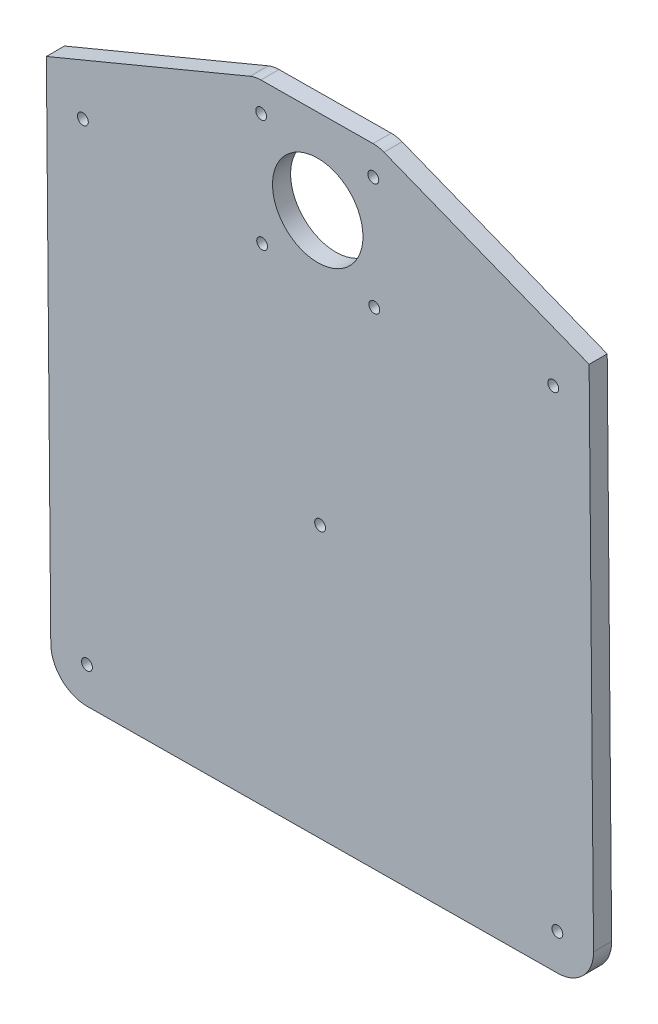
ISO-10303-21;
HEADER;
FILE_DESCRIPTION(('STEP AP214'),'2;1');
FILE_NAME('part.step','',(''),(''),'','','');
FILE_SCHEMA(('AUTOMOTIVE_DESIGN { 1 0 10303 214 1 1 1 1 }'));
ENDSEC;
DATA;
#1=APPLICATION_CONTEXT('core data for automotive mechanical design processes');
#2=APPLICATION_PROTOCOL_DEFINITION('international standard','automotive_design',2000,#1);
#3=PRODUCT_CONTEXT('',#1,'mechanical');
#4=PRODUCT('Part','Part','',(#3));
#5=PRODUCT_RELATED_PRODUCT_CATEGORY('part','',(#4));
#6=PRODUCT_DEFINITION_FORMATION('','',#4);
#7=PRODUCT_DEFINITION_CONTEXT('part definition',#1,'design');
#8=PRODUCT_DEFINITION('design','',#6,#7);
#9=PRODUCT_DEFINITION_SHAPE('','',#8);
#10=(LENGTH_UNIT() NAMED_UNIT(*) SI_UNIT(.MILLI.,.METRE.));
#11=(NAMED_UNIT(*) PLANE_ANGLE_UNIT() SI_UNIT($,.RADIAN.));
#12=(NAMED_UNIT(*) SI_UNIT($,.STERADIAN.) SOLID_ANGLE_UNIT());
#13=UNCERTAINTY_MEASURE_WITH_UNIT(LENGTH_MEASURE(1.E-05),#10,'distance_accuracy_value','');
#14=(GEOMETRIC_REPRESENTATION_CONTEXT(3) GLOBAL_UNCERTAINTY_ASSIGNED_CONTEXT((#13)) GLOBAL_UNIT_ASSIGNED_CONTEXT((#10,
#11,#12)) REPRESENTATION_CONTEXT('',''));
#15=CARTESIAN_POINT('',(0.,0.,0.));
#16=DIRECTION('',(0.,0.,1.));
#17=DIRECTION('',(1.,0.,0.));
#18=AXIS2_PLACEMENT_3D('',#15,#16,#17);
#19=CARTESIAN_POINT('',(65.5647498088941,-64.4303001875905,-2.4999999999521));
#20=DIRECTION('',(7.37104509450021E-13,0.,-1.));
#21=DIRECTION('',(0.999961923064146,0.0087265355012742,7.37132577199878E-13));
#22=AXIS2_PLACEMENT_3D('',#19,#20,#21);
#23=PLANE('',#22);
#24=CARTESIAN_POINT('',(64.4303001937285,65.5647498107485,-2.4999999999521));
#25=DIRECTION('',(7.37104509450021E-13,0.,-1.));
#26=DIRECTION('',(0.999961923064146,0.0087265355012742,7.37132577199878E-13));
#27=AXIS2_PLACEMENT_3D('',#24,#25,#26);
#28=CIRCLE('',#27,1.5);
#29=CARTESIAN_POINT('',(65.9302430783247,65.5778396140005,-2.49999999995099));
#30=VERTEX_POINT('',#29);
#31=EDGE_CURVE('E259',#30,#30,#28,.T.);
#32=ORIENTED_EDGE('',*,*,#31,.F.);
#33=EDGE_LOOP('',(#32));
#34=FACE_BOUND('',#33,.T.);
#35=CARTESIAN_POINT('',(-64.4303001894448,-65.5647498027561,-2.50000000004793));
#36=DIRECTION('',(7.37104509450021E-13,0.,-1.));
#37=DIRECTION('',(0.999961923064146,0.0087265355012742,7.37132577199878E-13));
#38=AXIS2_PLACEMENT_3D('',#35,#36,#37);
#39=CIRCLE('',#38,1.5);
#40=CARTESIAN_POINT('',(-62.9303573048486,-65.5516599995042,-2.50000000004682));
#41=VERTEX_POINT('',#40);
#42=EDGE_CURVE('E247',#41,#41,#39,.T.);
#43=ORIENTED_EDGE('',*,*,#42,.F.);
#44=EDGE_LOOP('',(#43));
#45=FACE_BOUND('',#44,.T.);
#46=CARTESIAN_POINT('',(-65.5647498046105,64.4303001955829,-2.50000000004793));
#47=DIRECTION('',(7.37104509450021E-13,0.,-1.));
#48=DIRECTION('',(0.999961923064146,0.0087265355012742,7.37132577199878E-13));
#49=AXIS2_PLACEMENT_3D('',#46,#47,#48);
#50=CIRCLE('',#49,1.5);
#51=CARTESIAN_POINT('',(-64.0648069200142,64.4433899988348,-2.50000000004682));
#52=VERTEX_POINT('',#51);
#53=EDGE_CURVE('E235',#52,#52,#50,.T.);
#54=ORIENTED_EDGE('',*,*,#53,.F.);
#55=EDGE_LOOP('',(#54));
#56=FACE_BOUND('',#55,.T.);
#57=CARTESIAN_POINT('',(14.9801809473103,59.6329957265826,-2.49999999998859));
#58=DIRECTION('',(7.37104509450021E-13,0.,-1.));
#59=DIRECTION('',(0.999961923064146,0.0087265355012742,7.37132577199878E-13));
#60=AXIS2_PLACEMENT_3D('',#57,#58,#59);
#61=CIRCLE('',#60,1.5);
#62=CARTESIAN_POINT('',(16.4801238319065,59.6460855298345,-2.49999999998748));
#63=VERTEX_POINT('',#62);
#64=EDGE_CURVE('E223',#63,#63,#61,.T.);
#65=ORIENTED_EDGE('',*,*,#64,.F.);
#66=EDGE_LOOP('',(#65));
#67=FACE_BOUND('',#66,.T.);
#68=CARTESIAN_POINT('',(-16.2891612682177,90.3612927410316,-2.50000000001144));
#69=DIRECTION('',(7.37104509450021E-13,0.,-1.));
#70=DIRECTION('',(0.999961923064146,0.0087265355012742,7.37132577199878E-13));
#71=AXIS2_PLACEMENT_3D('',#68,#69,#70);
#72=CIRCLE('',#71,1.5);
#73=CARTESIAN_POINT('',(-14.7892183836215,90.3743825442835,-2.50000000001033));
#74=VERTEX_POINT('',#73);
#75=EDGE_CURVE('E151',#74,#74,#72,.T.);
#76=ORIENTED_EDGE('',*,*,#75,.F.);
#77=EDGE_LOOP('',(#76));
#78=FACE_BOUND('',#77,.T.);
#79=DIRECTION('',(0.92992224530798,-0.367756193260379,6.83084246962648E-13));
#80=VECTOR('',#79,1.);
#81=CARTESIAN_POINT('',(17.6517078928538,98.071193304035,-2.49999999998637));
#82=LINE('',#81,#80);
#83=CARTESIAN_POINT('',(17.6517078928538,98.071193304035,-2.49999999998637));
#84=VERTEX_POINT('',#83);
#85=CARTESIAN_POINT('',(74.3426540693572,75.6516343964027,-2.49999999994473));
#86=VERTEX_POINT('',#85);
#87=EDGE_CURVE('E166',#84,#86,#82,.T.);
#88=ORIENTED_EDGE('',*,*,#87,.T.);
#89=DIRECTION('',(0.0087265355012742,-0.999961923064146,0.));
#90=VECTOR('',#89,1.);
#91=CARTESIAN_POINT('',(74.3426540693572,75.6516343964027,-2.49999999994473));
#92=LINE('',#91,#90);
#93=CARTESIAN_POINT('',(75.5643690395356,-64.3430348325777,-2.49999999994473));
#94=VERTEX_POINT('',#93);
#95=EDGE_CURVE('E104',#86,#94,#92,.T.);
#96=ORIENTED_EDGE('',*,*,#95,.T.);
#97=CARTESIAN_POINT('',(65.5647498088941,-64.4303001875905,-2.4999999999521));
#98=DIRECTION('',(7.37104509450021E-13,0.,-1.));
#99=DIRECTION('',(0.999961923064146,0.0087265355012742,7.37132577199878E-13));
#100=AXIS2_PLACEMENT_3D('',#97,#98,#99);
#101=CIRCLE('',#100,10.);
#102=CARTESIAN_POINT('',(65.6520151639068,-74.4299194182319,-2.4999999999521));
#103=VERTEX_POINT('',#102);
#104=EDGE_CURVE('E187',#94,#103,#101,.T.);
#105=ORIENTED_EDGE('',*,*,#104,.T.);
#106=DIRECTION('',(-0.999961923064146,-0.0087265355012742,-7.37132577199878E-13));
#107=VECTOR('',#106,1.);
#108=CARTESIAN_POINT('',(65.6520151639068,-74.4299194182319,-2.4999999999521));
#109=LINE('',#108,#107);
#110=CARTESIAN_POINT('',(-64.3430348344321,-75.5643690333976,-2.50000000004793));
#111=VERTEX_POINT('',#110);
#112=EDGE_CURVE('E206',#103,#111,#109,.T.);
#113=ORIENTED_EDGE('',*,*,#112,.T.);
#114=CARTESIAN_POINT('',(-64.4303001894448,-65.5647498027561,-2.50000000004793));
#115=DIRECTION('',(7.37104509450021E-13,0.,-1.));
#116=DIRECTION('',(-0.999961923064146,-0.0087265355012742,-7.37132577199878E-13));
#117=AXIS2_PLACEMENT_3D('',#114,#115,#116);
#118=CIRCLE('',#117,10.);
#119=CARTESIAN_POINT('',(-74.4299194200863,-65.6520151577689,-2.5000000000553));
#120=VERTEX_POINT('',#119);
#121=EDGE_CURVE('E203',#111,#120,#118,.T.);
#122=ORIENTED_EDGE('',*,*,#121,.T.);
#123=DIRECTION('',(-0.0087265355012744,0.999961923064146,0.));
#124=VECTOR('',#123,1.);
#125=CARTESIAN_POINT('',(-75.6516343902647,74.3426540712116,-2.5000000000553));
#126=LINE('',#125,#124);
#127=CARTESIAN_POINT('',(-75.6516343902647,74.3426540712116,-2.5000000000553));
#128=VERTEX_POINT('',#127);
#129=EDGE_CURVE('E205',#120,#128,#126,.T.);
#130=ORIENTED_EDGE('',*,*,#129,.T.);
#131=DIRECTION('',(0.923362383089004,0.383929563196421,6.83084246962648E-13));
#132=VECTOR('',#131,1.);
#133=CARTESIAN_POINT('',(-19.3605977737891,97.7481918057437,-2.50000000001366));
#134=LINE('',#133,#132);
#135=CARTESIAN_POINT('',(-19.3605977737891,97.7481918057437,-2.50000000001366));
#136=VERTEX_POINT('',#135);
#137=EDGE_CURVE('E129',#128,#136,#134,.T.);
#138=ORIENTED_EDGE('',*,*,#137,.T.);
#139=CARTESIAN_POINT('',(-16.2891612682177,90.3612927410316,-2.50000000001144));
#140=DIRECTION('',(7.37104509450021E-13,0.,-1.));
#141=DIRECTION('',(-0.999961923064146,-0.0087265355012742,-7.37132577199878E-13));
#142=AXIS2_PLACEMENT_3D('',#139,#140,#141);
#143=CIRCLE('',#142,7.99999999999999);
#144=CARTESIAN_POINT('',(-16.3589735522279,98.3609881255448,-2.50000000001144));
#145=VERTEX_POINT('',#144);
#146=EDGE_CURVE('E123',#136,#145,#143,.T.);
#147=ORIENTED_EDGE('',*,*,#146,.T.);
#148=DIRECTION('',(0.999961923064146,0.0087265355012742,7.37132577199878E-13));
#149=VECTOR('',#148,1.);
#150=CARTESIAN_POINT('',(14.6398460627606,98.6315107260843,-2.49999999998859));
#151=LINE('',#150,#149);
#152=CARTESIAN_POINT('',(14.6398460627606,98.6315107260843,-2.49999999998859));
#153=VERTEX_POINT('',#152);
#154=EDGE_CURVE('E127',#145,#153,#151,.T.);
#155=ORIENTED_EDGE('',*,*,#154,.T.);
#156=CARTESIAN_POINT('',(14.7096583467708,90.6318153415711,-2.49999999998859));
#157=DIRECTION('',(7.37104509450021E-13,0.,-1.));
#158=DIRECTION('',(0.999961923064146,0.0087265355012742,7.37132577199878E-13));
#159=AXIS2_PLACEMENT_3D('',#156,#157,#158);
#160=CIRCLE('',#159,8.00000000000001);
#161=EDGE_CURVE('E55',#153,#84,#160,.T.);
#162=ORIENTED_EDGE('',*,*,#161,.T.);
#163=EDGE_LOOP('',(#88,#96,#105,#113,#122,#130,#138,#147,#155,#162));
#164=FACE_BOUND('',#163,.T.);
#165=CARTESIAN_POINT('',(14.7096583467708,90.6318153415711,-2.49999999998859));
#166=DIRECTION('',(7.37104509450021E-13,0.,-1.));
#167=DIRECTION('',(0.999961923064146,0.0087265355012742,7.37132577199878E-13));
#168=AXIS2_PLACEMENT_3D('',#165,#166,#167);
#169=CIRCLE('',#168,1.50000000000001);
#170=CARTESIAN_POINT('',(16.209601231367,90.644905144823,-2.49999999998748));
#171=VERTEX_POINT('',#170);
#172=EDGE_CURVE('E217',#171,#171,#169,.T.);
#173=ORIENTED_EDGE('',*,*,#172,.F.);
#174=EDGE_LOOP('',(#173));
#175=FACE_BOUND('',#174,.T.);
#176=CARTESIAN_POINT('',(-16.0186386676782,59.3624731260431,-2.50000000001144));
#177=DIRECTION('',(7.37104509450021E-13,0.,-1.));
#178=DIRECTION('',(0.999961923064146,0.0087265355012742,7.37132577199878E-13));
#179=AXIS2_PLACEMENT_3D('',#176,#177,#178);
#180=CIRCLE('',#179,1.5);
#181=CARTESIAN_POINT('',(-14.518695783082,59.375562929295,-2.50000000001033));
#182=VERTEX_POINT('',#181);
#183=EDGE_CURVE('E229',#182,#182,#180,.T.);
#184=ORIENTED_EDGE('',*,*,#183,.F.);
#185=EDGE_LOOP('',(#184));
#186=FACE_BOUND('',#185,.T.);
#187=CARTESIAN_POINT('',(-0.654490160453739,74.9971442338071,-2.50000000000001));
#188=DIRECTION('',(7.37104509450021E-13,0.,-1.));
#189=DIRECTION('',(0.999961923064146,0.0087265355012742,7.37132577199878E-13));
#190=AXIS2_PLACEMENT_3D('',#187,#188,#189);
#191=CIRCLE('',#190,12.5);
#192=CARTESIAN_POINT('',(11.8450338778481,75.1062259275731,-2.4999999999908));
#193=VERTEX_POINT('',#192);
#194=EDGE_CURVE('E241',#193,#193,#191,.T.);
#195=ORIENTED_EDGE('',*,*,#194,.F.);
#196=EDGE_LOOP('',(#195));
#197=FACE_BOUND('',#196,.T.);
#198=CARTESIAN_POINT('',(65.5647498088941,-64.4303001875905,-2.4999999999521));
#199=DIRECTION('',(7.37104509450021E-13,0.,-1.));
#200=DIRECTION('',(0.999961923064146,0.0087265355012742,7.37132577199878E-13));
#201=AXIS2_PLACEMENT_3D('',#198,#199,#200);
#202=CIRCLE('',#201,1.5);
#203=CARTESIAN_POINT('',(67.0646926934903,-64.4172103843385,-2.49999999995099));
#204=VERTEX_POINT('',#203);
#205=EDGE_CURVE('E253',#204,#204,#202,.T.);
#206=ORIENTED_EDGE('',*,*,#205,.F.);
#207=EDGE_LOOP('',(#206));
#208=FACE_BOUND('',#207,.T.);
#209=CARTESIAN_POINT('',(2.14182664659557E-09,3.99620267432788E-09,-2.50000000000001));
#210=DIRECTION('',(7.37104509450021E-13,0.,-1.));
#211=DIRECTION('',(0.999961923064146,0.0087265355012742,7.37132577199878E-13));
#212=AXIS2_PLACEMENT_3D('',#209,#210,#211);
#213=CIRCLE('',#212,1.5);
#214=CARTESIAN_POINT('',(1.49994288673805,0.013089807248114,-2.49999999999891));
#215=VERTEX_POINT('',#214);
#216=EDGE_CURVE('E265',#215,#215,#213,.T.);
#217=ORIENTED_EDGE('',*,*,#216,.F.);
#218=EDGE_LOOP('',(#217));
#219=FACE_BOUND('',#218,.T.);
#220=ADVANCED_FACE('F38',(#34,#45,#56,#67,#78,#164,#175,#186,#197,#208,#219),#23,.T.);
#221=CARTESIAN_POINT('',(65.5647498088904,-64.4303001875905,2.5000000000479));
#222=DIRECTION('',(7.37104509450021E-13,0.,-1.));
#223=DIRECTION('',(0.999961923064146,0.0087265355012742,7.37132577199878E-13));
#224=AXIS2_PLACEMENT_3D('',#221,#222,#223);
#225=PLANE('',#224);
#226=DIRECTION('',(0.92992224530798,-0.367756193260379,6.83084246962648E-13));
#227=VECTOR('',#226,1.);
#228=CARTESIAN_POINT('',(17.6517078928501,98.071193304035,2.50000000001363));
#229=LINE('',#228,#227);
#230=CARTESIAN_POINT('',(17.6517078928501,98.0711933040349,2.50000000001363));
#231=VERTEX_POINT('',#230);
#232=CARTESIAN_POINT('',(74.3426540693535,75.6516343964027,2.50000000005527));
#233=VERTEX_POINT('',#232);
#234=EDGE_CURVE('E147',#231,#233,#229,.T.);
#235=ORIENTED_EDGE('',*,*,#234,.F.);
#236=CARTESIAN_POINT('',(14.7096583467671,90.6318153415711,2.50000000001141));
#237=DIRECTION('',(7.37104509450021E-13,0.,-1.));
#238=DIRECTION('',(0.999961923064146,0.0087265355012742,7.37132577199878E-13));
#239=AXIS2_PLACEMENT_3D('',#236,#237,#238);
#240=CIRCLE('',#239,8.00000000000001);
#241=CARTESIAN_POINT('',(14.6398460627569,98.6315107260843,2.50000000001141));
#242=VERTEX_POINT('',#241);
#243=EDGE_CURVE('E96',#242,#231,#240,.T.);
#244=ORIENTED_EDGE('',*,*,#243,.F.);
#245=DIRECTION('',(0.999961923064146,0.0087265355012742,7.37132577199878E-13));
#246=VECTOR('',#245,1.);
#247=CARTESIAN_POINT('',(14.6398460627569,98.6315107260843,2.50000000001141));
#248=LINE('',#247,#246);
#249=CARTESIAN_POINT('',(-16.3589735522316,98.3609881255448,2.49999999998856));
#250=VERTEX_POINT('',#249);
#251=EDGE_CURVE('E90',#250,#242,#248,.T.);
#252=ORIENTED_EDGE('',*,*,#251,.F.);
#253=CARTESIAN_POINT('',(-16.2891612682214,90.3612927410316,2.49999999998856));
#254=DIRECTION('',(7.37104509450021E-13,0.,-1.));
#255=DIRECTION('',(-0.999961923064146,-0.0087265355012742,-7.37132577199878E-13));
#256=AXIS2_PLACEMENT_3D('',#253,#254,#255);
#257=CIRCLE('',#256,7.99999999999999);
#258=CARTESIAN_POINT('',(-19.3605977737928,97.7481918057436,2.49999999998634));
#259=VERTEX_POINT('',#258);
#260=EDGE_CURVE('E137',#259,#250,#257,.T.);
#261=ORIENTED_EDGE('',*,*,#260,.F.);
#262=DIRECTION('',(0.923362383089004,0.383929563196421,6.83084246962648E-13));
#263=VECTOR('',#262,1.);
#264=CARTESIAN_POINT('',(-19.3605977737928,97.7481918057436,2.49999999998634));
#265=LINE('',#264,#263);
#266=CARTESIAN_POINT('',(-75.6516343902684,74.3426540712115,2.4999999999447));
#267=VERTEX_POINT('',#266);
#268=EDGE_CURVE('E161',#267,#259,#265,.T.);
#269=ORIENTED_EDGE('',*,*,#268,.F.);
#270=DIRECTION('',(-0.0087265355012744,0.999961923064146,0.));
#271=VECTOR('',#270,1.);
#272=CARTESIAN_POINT('',(-75.6516343902684,74.3426540712115,2.4999999999447));
#273=LINE('',#272,#271);
#274=CARTESIAN_POINT('',(-74.42991942009,-65.6520151577689,2.4999999999447));
#275=VERTEX_POINT('',#274);
#276=EDGE_CURVE('E159',#275,#267,#273,.T.);
#277=ORIENTED_EDGE('',*,*,#276,.F.);
#278=CARTESIAN_POINT('',(-64.4303001894485,-65.5647498027561,2.49999999995207));
#279=DIRECTION('',(7.37104509450021E-13,0.,-1.));
#280=DIRECTION('',(-0.999961923064146,-0.0087265355012742,-7.37132577199878E-13));
#281=AXIS2_PLACEMENT_3D('',#278,#279,#280);
#282=CIRCLE('',#281,10.);
#283=CARTESIAN_POINT('',(-64.3430348344358,-75.5643690333976,2.49999999995207));
#284=VERTEX_POINT('',#283);
#285=EDGE_CURVE('E157',#284,#275,#282,.T.);
#286=ORIENTED_EDGE('',*,*,#285,.F.);
#287=DIRECTION('',(-0.999961923064146,-0.0087265355012742,-7.37132577199878E-13));
#288=VECTOR('',#287,1.);
#289=CARTESIAN_POINT('',(65.6520151639032,-74.429919418232,2.5000000000479));
#290=LINE('',#289,#288);
#291=CARTESIAN_POINT('',(65.6520151639032,-74.429919418232,2.5000000000479));
#292=VERTEX_POINT('',#291);
#293=EDGE_CURVE('E155',#292,#284,#290,.T.);
#294=ORIENTED_EDGE('',*,*,#293,.F.);
#295=CARTESIAN_POINT('',(65.5647498088904,-64.4303001875905,2.5000000000479));
#296=DIRECTION('',(7.37104509450021E-13,0.,-1.));
#297=DIRECTION('',(0.999961923064146,0.0087265355012742,7.37132577199878E-13));
#298=AXIS2_PLACEMENT_3D('',#295,#296,#297);
#299=CIRCLE('',#298,10.);
#300=CARTESIAN_POINT('',(75.5643690395319,-64.3430348325778,2.50000000005527));
#301=VERTEX_POINT('',#300);
#302=EDGE_CURVE('E153',#301,#292,#299,.T.);
#303=ORIENTED_EDGE('',*,*,#302,.F.);
#304=DIRECTION('',(0.0087265355012742,-0.999961923064146,0.));
#305=VECTOR('',#304,1.);
#306=CARTESIAN_POINT('',(74.3426540693535,75.6516343964027,2.50000000005527));
#307=LINE('',#306,#305);
#308=EDGE_CURVE('E150',#233,#301,#307,.T.);
#309=ORIENTED_EDGE('',*,*,#308,.F.);
#310=EDGE_LOOP('',(#235,#244,#252,#261,#269,#277,#286,#294,#303,#309));
#311=FACE_BOUND('',#310,.T.);
#312=CARTESIAN_POINT('',(-16.2891612682214,90.3612927410316,2.49999999998856));
#313=DIRECTION('',(7.37104509450021E-13,0.,-1.));
#314=DIRECTION('',(0.999961923064146,0.0087265355012742,7.37132577199878E-13));
#315=AXIS2_PLACEMENT_3D('',#312,#313,#314);
#316=CIRCLE('',#315,1.5);
#317=CARTESIAN_POINT('',(-14.7892183836252,90.3743825442835,2.49999999998967));
#318=VERTEX_POINT('',#317);
#319=EDGE_CURVE('E214',#318,#318,#316,.T.);
#320=ORIENTED_EDGE('',*,*,#319,.T.);
#321=EDGE_LOOP('',(#320));
#322=FACE_BOUND('',#321,.T.);
#323=CARTESIAN_POINT('',(14.7096583467671,90.6318153415711,2.50000000001141));
#324=DIRECTION('',(7.37104509450021E-13,0.,-1.));
#325=DIRECTION('',(0.999961923064146,0.0087265355012742,7.37132577199878E-13));
#326=AXIS2_PLACEMENT_3D('',#323,#324,#325);
#327=CIRCLE('',#326,1.50000000000001);
#328=CARTESIAN_POINT('',(16.2096012313633,90.644905144823,2.50000000001252));
#329=VERTEX_POINT('',#328);
#330=EDGE_CURVE('E220',#329,#329,#327,.T.);
#331=ORIENTED_EDGE('',*,*,#330,.T.);
#332=EDGE_LOOP('',(#331));
#333=FACE_BOUND('',#332,.T.);
#334=CARTESIAN_POINT('',(14.9801809473066,59.6329957265826,2.50000000001141));
#335=DIRECTION('',(7.37104509450021E-13,0.,-1.));
#336=DIRECTION('',(0.999961923064146,0.0087265355012742,7.37132577199878E-13));
#337=AXIS2_PLACEMENT_3D('',#334,#335,#336);
#338=CIRCLE('',#337,1.5);
#339=CARTESIAN_POINT('',(16.4801238319028,59.6460855298345,2.50000000001252));
#340=VERTEX_POINT('',#339);
#341=EDGE_CURVE('E226',#340,#340,#338,.T.);
#342=ORIENTED_EDGE('',*,*,#341,.T.);
#343=EDGE_LOOP('',(#342));
#344=FACE_BOUND('',#343,.T.);
#345=CARTESIAN_POINT('',(-16.0186386676819,59.3624731260431,2.49999999998856));
#346=DIRECTION('',(7.37104509450021E-13,0.,-1.));
#347=DIRECTION('',(0.999961923064146,0.0087265355012742,7.37132577199878E-13));
#348=AXIS2_PLACEMENT_3D('',#345,#346,#347);
#349=CIRCLE('',#348,1.5);
#350=CARTESIAN_POINT('',(-14.5186957830857,59.375562929295,2.49999999998967));
#351=VERTEX_POINT('',#350);
#352=EDGE_CURVE('E232',#351,#351,#349,.T.);
#353=ORIENTED_EDGE('',*,*,#352,.T.);
#354=EDGE_LOOP('',(#353));
#355=FACE_BOUND('',#354,.T.);
#356=CARTESIAN_POINT('',(-65.5647498046142,64.4303001955828,2.49999999995207));
#357=DIRECTION('',(7.37104509450021E-13,0.,-1.));
#358=DIRECTION('',(0.999961923064146,0.0087265355012742,7.37132577199878E-13));
#359=AXIS2_PLACEMENT_3D('',#356,#357,#358);
#360=CIRCLE('',#359,1.5);
#361=CARTESIAN_POINT('',(-64.0648069200179,64.4433899988348,2.49999999995318));
#362=VERTEX_POINT('',#361);
#363=EDGE_CURVE('E238',#362,#362,#360,.T.);
#364=ORIENTED_EDGE('',*,*,#363,.T.);
#365=EDGE_LOOP('',(#364));
#366=FACE_BOUND('',#365,.T.);
#367=CARTESIAN_POINT('',(-0.654490160457426,74.9971442338071,2.49999999999999));
#368=DIRECTION('',(7.37104509450021E-13,0.,-1.));
#369=DIRECTION('',(0.999961923064146,0.0087265355012742,7.37132577199878E-13));
#370=AXIS2_PLACEMENT_3D('',#367,#368,#369);
#371=CIRCLE('',#370,12.5);
#372=CARTESIAN_POINT('',(11.8450338778444,75.106225927573,2.5000000000092));
#373=VERTEX_POINT('',#372);
#374=EDGE_CURVE('E244',#373,#373,#371,.T.);
#375=ORIENTED_EDGE('',*,*,#374,.T.);
#376=EDGE_LOOP('',(#375));
#377=FACE_BOUND('',#376,.T.);
#378=CARTESIAN_POINT('',(-64.4303001894485,-65.5647498027561,2.49999999995207));
#379=DIRECTION('',(7.37104509450021E-13,0.,-1.));
#380=DIRECTION('',(0.999961923064146,0.0087265355012742,7.37132577199878E-13));
#381=AXIS2_PLACEMENT_3D('',#378,#379,#380);
#382=CIRCLE('',#381,1.5);
#383=CARTESIAN_POINT('',(-62.9303573048523,-65.5516599995042,2.49999999995318));
#384=VERTEX_POINT('',#383);
#385=EDGE_CURVE('E250',#384,#384,#382,.T.);
#386=ORIENTED_EDGE('',*,*,#385,.T.);
#387=EDGE_LOOP('',(#386));
#388=FACE_BOUND('',#387,.T.);
#389=CARTESIAN_POINT('',(65.5647498088904,-64.4303001875905,2.5000000000479));
#390=DIRECTION('',(7.37104509450021E-13,0.,-1.));
#391=DIRECTION('',(0.999961923064146,0.0087265355012742,7.37132577199878E-13));
#392=AXIS2_PLACEMENT_3D('',#389,#390,#391);
#393=CIRCLE('',#392,1.5);
#394=CARTESIAN_POINT('',(67.0646926934866,-64.4172103843386,2.50000000004901));
#395=VERTEX_POINT('',#394);
#396=EDGE_CURVE('E256',#395,#395,#393,.T.);
#397=ORIENTED_EDGE('',*,*,#396,.T.);
#398=EDGE_LOOP('',(#397));
#399=FACE_BOUND('',#398,.T.);
#400=CARTESIAN_POINT('',(64.4303001937248,65.5647498107485,2.5000000000479));
#401=DIRECTION('',(7.37104509450021E-13,0.,-1.));
#402=DIRECTION('',(0.999961923064146,0.0087265355012742,7.37132577199878E-13));
#403=AXIS2_PLACEMENT_3D('',#400,#401,#402);
#404=CIRCLE('',#403,1.5);
#405=CARTESIAN_POINT('',(65.930243078321,65.5778396140004,2.50000000004901));
#406=VERTEX_POINT('',#405);
#407=EDGE_CURVE('E262',#406,#406,#404,.T.);
#408=ORIENTED_EDGE('',*,*,#407,.T.);
#409=EDGE_LOOP('',(#408));
#410=FACE_BOUND('',#409,.T.);
#411=CARTESIAN_POINT('',(2.13814035920912E-09,3.99616971458183E-09,2.49999999999999));
#412=DIRECTION('',(7.37104509450021E-13,0.,-1.));
#413=DIRECTION('',(0.999961923064146,0.0087265355012742,7.37132577199878E-13));
#414=AXIS2_PLACEMENT_3D('',#411,#412,#413);
#415=CIRCLE('',#414,1.5);
#416=CARTESIAN_POINT('',(1.49994288673436,0.013089807248081,2.50000000000109));
#417=VERTEX_POINT('',#416);
#418=EDGE_CURVE('E268',#417,#417,#415,.T.);
#419=ORIENTED_EDGE('',*,*,#418,.T.);
#420=EDGE_LOOP('',(#419));
#421=FACE_BOUND('',#420,.T.);
#422=ADVANCED_FACE('F191',(#311,#322,#333,#344,#355,#366,#377,#388,#399,#410,#421),#225,.F.);
#423=CARTESIAN_POINT('',(17.6517078928538,98.071193304035,-2.49999999998637));
#424=DIRECTION('',(-0.367756193260379,-0.92992224530798,-2.77056578916304E-13));
#425=DIRECTION('',(-0.92992224530798,0.367756193260379,-6.83084246962648E-13));
#426=AXIS2_PLACEMENT_3D('',#423,#424,#425);
#427=PLANE('',#426);
#428=ORIENTED_EDGE('',*,*,#234,.T.);
#429=DIRECTION('',(-7.37104509450021E-13,0.,1.));
#430=VECTOR('',#429,1.);
#431=CARTESIAN_POINT('',(74.3426540693572,75.6516343964027,-2.49999999994473));
#432=LINE('',#431,#430);
#433=EDGE_CURVE('E11',#86,#233,#432,.T.);
#434=ORIENTED_EDGE('',*,*,#433,.F.);
#435=ORIENTED_EDGE('',*,*,#87,.F.);
#436=DIRECTION('',(-7.37104509450021E-13,0.,1.));
#437=VECTOR('',#436,1.);
#438=CARTESIAN_POINT('',(17.6517078928538,98.071193304035,-2.49999999998637));
#439=LINE('',#438,#437);
#440=EDGE_CURVE('E143',#84,#231,#439,.T.);
#441=ORIENTED_EDGE('',*,*,#440,.T.);
#442=EDGE_LOOP('',(#428,#434,#435,#441));
#443=FACE_BOUND('',#442,.T.);
#444=ADVANCED_FACE('F40',(#443),#427,.F.);
#445=CARTESIAN_POINT('',(74.3426540693572,75.6516343964027,-2.49999999994473));
#446=DIRECTION('',(-0.999961923064146,-0.0087265355012742,-7.37132577199878E-13));
#447=DIRECTION('',(-0.0087265355012742,0.999961923064146,0.));
#448=AXIS2_PLACEMENT_3D('',#445,#446,#447);
#449=PLANE('',#448);
#450=ORIENTED_EDGE('',*,*,#308,.T.);
#451=DIRECTION('',(-7.37104509450021E-13,0.,1.));
#452=VECTOR('',#451,1.);
#453=CARTESIAN_POINT('',(75.5643690395356,-64.3430348325777,-2.49999999994473));
#454=LINE('',#453,#452);
#455=EDGE_CURVE('E47',#94,#301,#454,.T.);
#456=ORIENTED_EDGE('',*,*,#455,.F.);
#457=ORIENTED_EDGE('',*,*,#95,.F.);
#458=ORIENTED_EDGE('',*,*,#433,.T.);
#459=EDGE_LOOP('',(#450,#456,#457,#458));
#460=FACE_BOUND('',#459,.T.);
#461=ADVANCED_FACE('F310',(#460),#449,.F.);
#462=CARTESIAN_POINT('',(65.5647498088941,-64.4303001875905,-2.4999999999521));
#463=DIRECTION('',(-7.37104509450021E-13,0.,1.));
#464=DIRECTION('',(-0.999961923064146,-0.0087265355012742,-7.37132577199878E-13));
#465=AXIS2_PLACEMENT_3D('',#462,#463,#464);
#466=CYLINDRICAL_SURFACE('',#465,10.);
#467=ORIENTED_EDGE('',*,*,#302,.T.);
#468=DIRECTION('',(-7.37104509450021E-13,0.,1.));
#469=VECTOR('',#468,1.);
#470=CARTESIAN_POINT('',(65.6520151639068,-74.4299194182319,-2.4999999999521));
#471=LINE('',#470,#469);
#472=EDGE_CURVE('E179',#103,#292,#471,.T.);
#473=ORIENTED_EDGE('',*,*,#472,.F.);
#474=ORIENTED_EDGE('',*,*,#104,.F.);
#475=ORIENTED_EDGE('',*,*,#455,.T.);
#476=EDGE_LOOP('',(#467,#473,#474,#475));
#477=FACE_BOUND('',#476,.T.);
#478=ADVANCED_FACE('F185',(#477),#466,.T.);
#479=CARTESIAN_POINT('',(65.6520151639068,-74.4299194182319,-2.4999999999521));
#480=DIRECTION('',(-0.0087265355012742,0.999961923064146,0.));
#481=DIRECTION('',(0.999961923064146,0.0087265355012742,7.37132577199878E-13));
#482=AXIS2_PLACEMENT_3D('',#479,#480,#481);
#483=PLANE('',#482);
#484=ORIENTED_EDGE('',*,*,#293,.T.);
#485=DIRECTION('',(-7.37104509450021E-13,0.,1.));
#486=VECTOR('',#485,1.);
#487=CARTESIAN_POINT('',(-64.3430348344321,-75.5643690333976,-2.50000000004793));
#488=LINE('',#487,#486);
#489=EDGE_CURVE('E176',#111,#284,#488,.T.);
#490=ORIENTED_EDGE('',*,*,#489,.F.);
#491=ORIENTED_EDGE('',*,*,#112,.F.);
#492=ORIENTED_EDGE('',*,*,#472,.T.);
#493=EDGE_LOOP('',(#484,#490,#491,#492));
#494=FACE_BOUND('',#493,.T.);
#495=ADVANCED_FACE('F197',(#494),#483,.F.);
#496=CARTESIAN_POINT('',(-64.4303001894448,-65.5647498027561,-2.50000000004793));
#497=DIRECTION('',(-7.37104509450021E-13,0.,1.));
#498=DIRECTION('',(-0.999961923064146,-0.0087265355012742,-7.37132577199878E-13));
#499=AXIS2_PLACEMENT_3D('',#496,#497,#498);
#500=CYLINDRICAL_SURFACE('',#499,10.);
#501=ORIENTED_EDGE('',*,*,#285,.T.);
#502=DIRECTION('',(-7.37104509450021E-13,0.,1.));
#503=VECTOR('',#502,1.);
#504=CARTESIAN_POINT('',(-74.4299194200863,-65.6520151577689,-2.5000000000553));
#505=LINE('',#504,#503);
#506=EDGE_CURVE('E173',#120,#275,#505,.T.);
#507=ORIENTED_EDGE('',*,*,#506,.F.);
#508=ORIENTED_EDGE('',*,*,#121,.F.);
#509=ORIENTED_EDGE('',*,*,#489,.T.);
#510=EDGE_LOOP('',(#501,#507,#508,#509));
#511=FACE_BOUND('',#510,.T.);
#512=ADVANCED_FACE('F201',(#511),#500,.T.);
#513=CARTESIAN_POINT('',(-75.6516343902647,74.3426540712116,-2.5000000000553));
#514=DIRECTION('',(0.999961923064146,0.0087265355012744,7.37132577199878E-13));
#515=DIRECTION('',(0.0087265355012744,-0.999961923064146,0.));
#516=AXIS2_PLACEMENT_3D('',#513,#514,#515);
#517=PLANE('',#516);
#518=ORIENTED_EDGE('',*,*,#276,.T.);
#519=DIRECTION('',(-7.37104509450021E-13,0.,1.));
#520=VECTOR('',#519,1.);
#521=CARTESIAN_POINT('',(-75.6516343902647,74.3426540712116,-2.5000000000553));
#522=LINE('',#521,#520);
#523=EDGE_CURVE('E170',#128,#267,#522,.T.);
#524=ORIENTED_EDGE('',*,*,#523,.F.);
#525=ORIENTED_EDGE('',*,*,#129,.F.);
#526=ORIENTED_EDGE('',*,*,#506,.T.);
#527=EDGE_LOOP('',(#518,#524,#525,#526));
#528=FACE_BOUND('',#527,.T.);
#529=ADVANCED_FACE('F300',(#528),#517,.F.);
#530=CARTESIAN_POINT('',(-19.3605977737891,97.7481918057437,-2.50000000001366));
#531=DIRECTION('',(0.383929563196421,-0.923362383089004,2.77056578916304E-13));
#532=DIRECTION('',(-0.923362383089004,-0.383929563196421,-6.83084246962648E-13));
#533=AXIS2_PLACEMENT_3D('',#530,#531,#532);
#534=PLANE('',#533);
#535=ORIENTED_EDGE('',*,*,#268,.T.);
#536=DIRECTION('',(-7.37104509450021E-13,0.,1.));
#537=VECTOR('',#536,1.);
#538=CARTESIAN_POINT('',(-19.3605977737891,97.7481918057437,-2.50000000001366));
#539=LINE('',#538,#537);
#540=EDGE_CURVE('E138',#136,#259,#539,.T.);
#541=ORIENTED_EDGE('',*,*,#540,.F.);
#542=ORIENTED_EDGE('',*,*,#137,.F.);
#543=ORIENTED_EDGE('',*,*,#523,.T.);
#544=EDGE_LOOP('',(#535,#541,#542,#543));
#545=FACE_BOUND('',#544,.T.);
#546=ADVANCED_FACE('F297',(#545),#534,.F.);
#547=CARTESIAN_POINT('',(-16.2891612682177,90.3612927410316,-2.50000000001144));
#548=DIRECTION('',(-7.37104509450021E-13,0.,1.));
#549=DIRECTION('',(-0.999961923064146,-0.0087265355012742,-7.37132577199878E-13));
#550=AXIS2_PLACEMENT_3D('',#547,#548,#549);
#551=CYLINDRICAL_SURFACE('',#550,7.99999999999999);
#552=ORIENTED_EDGE('',*,*,#260,.T.);
#553=DIRECTION('',(-7.37104509450021E-13,0.,1.));
#554=VECTOR('',#553,1.);
#555=CARTESIAN_POINT('',(-16.3589735522279,98.3609881255448,-2.50000000001144));
#556=LINE('',#555,#554);
#557=EDGE_CURVE('E134',#145,#250,#556,.T.);
#558=ORIENTED_EDGE('',*,*,#557,.F.);
#559=ORIENTED_EDGE('',*,*,#146,.F.);
#560=ORIENTED_EDGE('',*,*,#540,.T.);
#561=EDGE_LOOP('',(#552,#558,#559,#560));
#562=FACE_BOUND('',#561,.T.);
#563=ADVANCED_FACE('F135',(#562),#551,.T.);
#564=CARTESIAN_POINT('',(14.6398460627606,98.6315107260843,-2.49999999998859));
#565=DIRECTION('',(0.0087265355012742,-0.999961923064146,0.));
#566=DIRECTION('',(-0.999961923064146,-0.0087265355012742,-7.37132577199878E-13));
#567=AXIS2_PLACEMENT_3D('',#564,#565,#566);
#568=PLANE('',#567);
#569=ORIENTED_EDGE('',*,*,#251,.T.);
#570=DIRECTION('',(-7.37104509450021E-13,0.,1.));
#571=VECTOR('',#570,1.);
#572=CARTESIAN_POINT('',(14.6398460627606,98.6315107260843,-2.49999999998859));
#573=LINE('',#572,#571);
#574=EDGE_CURVE('E139',#153,#242,#573,.T.);
#575=ORIENTED_EDGE('',*,*,#574,.F.);
#576=ORIENTED_EDGE('',*,*,#154,.F.);
#577=ORIENTED_EDGE('',*,*,#557,.T.);
#578=EDGE_LOOP('',(#569,#575,#576,#577));
#579=FACE_BOUND('',#578,.T.);
#580=ADVANCED_FACE('F141',(#579),#568,.F.);
#581=CARTESIAN_POINT('',(14.7096583467708,90.6318153415711,-2.49999999998859));
#582=DIRECTION('',(-7.37104509450021E-13,0.,1.));
#583=DIRECTION('',(-0.999961923064146,-0.0087265355012742,-7.37132577199878E-13));
#584=AXIS2_PLACEMENT_3D('',#581,#582,#583);
#585=CYLINDRICAL_SURFACE('',#584,8.00000000000001);
#586=ORIENTED_EDGE('',*,*,#243,.T.);
#587=ORIENTED_EDGE('',*,*,#440,.F.);
#588=ORIENTED_EDGE('',*,*,#161,.F.);
#589=ORIENTED_EDGE('',*,*,#574,.T.);
#590=EDGE_LOOP('',(#586,#587,#588,#589));
#591=FACE_BOUND('',#590,.T.);
#592=ADVANCED_FACE('F290',(#591),#585,.T.);
#593=CARTESIAN_POINT('',(-16.2891612682177,90.3612927410316,-2.50000000001144));
#594=DIRECTION('',(-7.37104509450021E-13,0.,1.));
#595=DIRECTION('',(-0.999961923064146,-0.0087265355012742,-7.37132577199878E-13));
#596=AXIS2_PLACEMENT_3D('',#593,#594,#595);
#597=CYLINDRICAL_SURFACE('',#596,1.5);
#598=ORIENTED_EDGE('',*,*,#75,.T.);
#599=EDGE_LOOP('',(#598));
#600=FACE_BOUND('',#599,.T.);
#601=ORIENTED_EDGE('',*,*,#319,.F.);
#602=EDGE_LOOP('',(#601));
#603=FACE_BOUND('',#602,.T.);
#604=ADVANCED_FACE('F287',(#600,#603),#597,.F.);
#605=CARTESIAN_POINT('',(14.7096583467708,90.6318153415711,-2.49999999998859));
#606=DIRECTION('',(-7.37104509450021E-13,0.,1.));
#607=DIRECTION('',(-0.999961923064146,-0.0087265355012742,-7.37132577199878E-13));
#608=AXIS2_PLACEMENT_3D('',#605,#606,#607);
#609=CYLINDRICAL_SURFACE('',#608,1.50000000000001);
#610=ORIENTED_EDGE('',*,*,#172,.T.);
#611=EDGE_LOOP('',(#610));
#612=FACE_BOUND('',#611,.T.);
#613=ORIENTED_EDGE('',*,*,#330,.F.);
#614=EDGE_LOOP('',(#613));
#615=FACE_BOUND('',#614,.T.);
#616=ADVANCED_FACE('F386',(#612,#615),#609,.F.);
#617=CARTESIAN_POINT('',(14.9801809473103,59.6329957265826,-2.49999999998859));
#618=DIRECTION('',(-7.37104509450021E-13,0.,1.));
#619=DIRECTION('',(-0.999961923064146,-0.0087265355012742,-7.37132577199878E-13));
#620=AXIS2_PLACEMENT_3D('',#617,#618,#619);
#621=CYLINDRICAL_SURFACE('',#620,1.5);
#622=ORIENTED_EDGE('',*,*,#64,.T.);
#623=EDGE_LOOP('',(#622));
#624=FACE_BOUND('',#623,.T.);
#625=ORIENTED_EDGE('',*,*,#341,.F.);
#626=EDGE_LOOP('',(#625));
#627=FACE_BOUND('',#626,.T.);
#628=ADVANCED_FACE('F394',(#624,#627),#621,.F.);
#629=CARTESIAN_POINT('',(-16.0186386676782,59.3624731260431,-2.50000000001144));
#630=DIRECTION('',(-7.37104509450021E-13,0.,1.));
#631=DIRECTION('',(-0.999961923064146,-0.0087265355012742,-7.37132577199878E-13));
#632=AXIS2_PLACEMENT_3D('',#629,#630,#631);
#633=CYLINDRICAL_SURFACE('',#632,1.5);
#634=ORIENTED_EDGE('',*,*,#183,.T.);
#635=EDGE_LOOP('',(#634));
#636=FACE_BOUND('',#635,.T.);
#637=ORIENTED_EDGE('',*,*,#352,.F.);
#638=EDGE_LOOP('',(#637));
#639=FACE_BOUND('',#638,.T.);
#640=ADVANCED_FACE('F402',(#636,#639),#633,.F.);
#641=CARTESIAN_POINT('',(-65.5647498046105,64.4303001955829,-2.50000000004793));
#642=DIRECTION('',(-7.37104509450021E-13,0.,1.));
#643=DIRECTION('',(-0.999961923064146,-0.0087265355012742,-7.37132577199878E-13));
#644=AXIS2_PLACEMENT_3D('',#641,#642,#643);
#645=CYLINDRICAL_SURFACE('',#644,1.5);
#646=ORIENTED_EDGE('',*,*,#53,.T.);
#647=EDGE_LOOP('',(#646));
#648=FACE_BOUND('',#647,.T.);
#649=ORIENTED_EDGE('',*,*,#363,.F.);
#650=EDGE_LOOP('',(#649));
#651=FACE_BOUND('',#650,.T.);
#652=ADVANCED_FACE('F411',(#648,#651),#645,.F.);
#653=CARTESIAN_POINT('',(-0.654490160453739,74.9971442338071,-2.50000000000001));
#654=DIRECTION('',(-7.37104509450021E-13,0.,1.));
#655=DIRECTION('',(-0.999961923064146,-0.0087265355012742,-7.37132577199878E-13));
#656=AXIS2_PLACEMENT_3D('',#653,#654,#655);
#657=CYLINDRICAL_SURFACE('',#656,12.5);
#658=ORIENTED_EDGE('',*,*,#194,.T.);
#659=EDGE_LOOP('',(#658));
#660=FACE_BOUND('',#659,.T.);
#661=ORIENTED_EDGE('',*,*,#374,.F.);
#662=EDGE_LOOP('',(#661));
#663=FACE_BOUND('',#662,.T.);
#664=ADVANCED_FACE('F420',(#660,#663),#657,.F.);
#665=CARTESIAN_POINT('',(-64.4303001894448,-65.5647498027561,-2.50000000004793));
#666=DIRECTION('',(-7.37104509450021E-13,0.,1.));
#667=DIRECTION('',(-0.999961923064146,-0.0087265355012742,-7.37132577199878E-13));
#668=AXIS2_PLACEMENT_3D('',#665,#666,#667);
#669=CYLINDRICAL_SURFACE('',#668,1.5);
#670=ORIENTED_EDGE('',*,*,#42,.T.);
#671=EDGE_LOOP('',(#670));
#672=FACE_BOUND('',#671,.T.);
#673=ORIENTED_EDGE('',*,*,#385,.F.);
#674=EDGE_LOOP('',(#673));
#675=FACE_BOUND('',#674,.T.);
#676=ADVANCED_FACE('F429',(#672,#675),#669,.F.);
#677=CARTESIAN_POINT('',(65.5647498088941,-64.4303001875905,-2.4999999999521));
#678=DIRECTION('',(-7.37104509450021E-13,0.,1.));
#679=DIRECTION('',(-0.999961923064146,-0.0087265355012742,-7.37132577199878E-13));
#680=AXIS2_PLACEMENT_3D('',#677,#678,#679);
#681=CYLINDRICAL_SURFACE('',#680,1.5);
#682=ORIENTED_EDGE('',*,*,#205,.T.);
#683=EDGE_LOOP('',(#682));
#684=FACE_BOUND('',#683,.T.);
#685=ORIENTED_EDGE('',*,*,#396,.F.);
#686=EDGE_LOOP('',(#685));
#687=FACE_BOUND('',#686,.T.);
#688=ADVANCED_FACE('F438',(#684,#687),#681,.F.);
#689=CARTESIAN_POINT('',(64.4303001937285,65.5647498107485,-2.4999999999521));
#690=DIRECTION('',(-7.37104509450021E-13,0.,1.));
#691=DIRECTION('',(-0.999961923064146,-0.0087265355012742,-7.37132577199878E-13));
#692=AXIS2_PLACEMENT_3D('',#689,#690,#691);
#693=CYLINDRICAL_SURFACE('',#692,1.5);
#694=ORIENTED_EDGE('',*,*,#31,.T.);
#695=EDGE_LOOP('',(#694));
#696=FACE_BOUND('',#695,.T.);
#697=ORIENTED_EDGE('',*,*,#407,.F.);
#698=EDGE_LOOP('',(#697));
#699=FACE_BOUND('',#698,.T.);
#700=ADVANCED_FACE('F447',(#696,#699),#693,.F.);
#701=CARTESIAN_POINT('',(2.14182664659557E-09,3.99620267432788E-09,-2.50000000000001));
#702=DIRECTION('',(-7.37104509450021E-13,0.,1.));
#703=DIRECTION('',(-0.999961923064146,-0.0087265355012742,-7.37132577199878E-13));
#704=AXIS2_PLACEMENT_3D('',#701,#702,#703);
#705=CYLINDRICAL_SURFACE('',#704,1.5);
#706=ORIENTED_EDGE('',*,*,#216,.T.);
#707=EDGE_LOOP('',(#706));
#708=FACE_BOUND('',#707,.T.);
#709=ORIENTED_EDGE('',*,*,#418,.F.);
#710=EDGE_LOOP('',(#709));
#711=FACE_BOUND('',#710,.T.);
#712=ADVANCED_FACE('F274',(#708,#711),#705,.F.);
#713=CLOSED_SHELL('',(#220,#422,#444,#461,#478,#495,#512,#529,#546,#563,#580,#592,#604,#616,
#628,#640,#652,#664,#676,#688,#700,#712));
#714=MANIFOLD_SOLID_BREP('B2',#713);
#715=ADVANCED_BREP_SHAPE_REPRESENTATION('',(#18,#714),#14);
#716=SHAPE_DEFINITION_REPRESENTATION(#9,#715);
ENDSEC;
END-ISO-10303-21;
